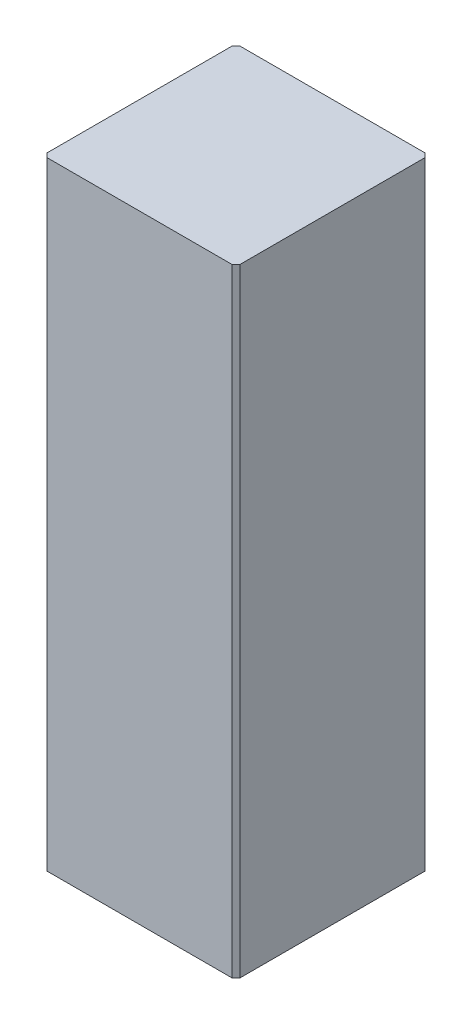
ISO-10303-21;
HEADER;
FILE_DESCRIPTION(('STEP AP214'),'2;1');
FILE_NAME('part.step','',(''),(''),'','','');
FILE_SCHEMA(('AUTOMOTIVE_DESIGN { 1 0 10303 214 1 1 1 1 }'));
ENDSEC;
DATA;
#1=APPLICATION_CONTEXT('core data for automotive mechanical design processes');
#2=APPLICATION_PROTOCOL_DEFINITION('international standard','automotive_design',2000,#1);
#3=PRODUCT_CONTEXT('',#1,'mechanical');
#4=PRODUCT('Part','Part','',(#3));
#5=PRODUCT_RELATED_PRODUCT_CATEGORY('part','',(#4));
#6=PRODUCT_DEFINITION_FORMATION('','',#4);
#7=PRODUCT_DEFINITION_CONTEXT('part definition',#1,'design');
#8=PRODUCT_DEFINITION('design','',#6,#7);
#9=PRODUCT_DEFINITION_SHAPE('','',#8);
#10=(LENGTH_UNIT() NAMED_UNIT(*) SI_UNIT(.MILLI.,.METRE.));
#11=(NAMED_UNIT(*) PLANE_ANGLE_UNIT() SI_UNIT($,.RADIAN.));
#12=(NAMED_UNIT(*) SI_UNIT($,.STERADIAN.) SOLID_ANGLE_UNIT());
#13=UNCERTAINTY_MEASURE_WITH_UNIT(LENGTH_MEASURE(1.E-05),#10,'distance_accuracy_value','');
#14=(GEOMETRIC_REPRESENTATION_CONTEXT(3) GLOBAL_UNCERTAINTY_ASSIGNED_CONTEXT((#13)) GLOBAL_UNIT_ASSIGNED_CONTEXT((#10,
#11,#12)) REPRESENTATION_CONTEXT('',''));
#15=CARTESIAN_POINT('',(0.,0.,0.));
#16=DIRECTION('',(0.,0.,1.));
#17=DIRECTION('',(1.,0.,0.));
#18=AXIS2_PLACEMENT_3D('',#15,#16,#17);
#19=CARTESIAN_POINT('',(0.,20.32,0.));
#20=DIRECTION('',(1.,0.,0.));
#21=DIRECTION('',(0.,0.,-1.));
#22=AXIS2_PLACEMENT_3D('',#19,#20,#21);
#23=PLANE('',#22);
#24=DIRECTION('',(0.,0.,1.));
#25=VECTOR('',#24,1.);
#26=CARTESIAN_POINT('',(0.,20.32,0.));
#27=LINE('',#26,#25);
#28=CARTESIAN_POINT('',(0.,20.32,-6.223));
#29=VERTEX_POINT('',#28);
#30=CARTESIAN_POINT('',(0.,20.32,-0.126999999999999));
#31=VERTEX_POINT('',#30);
#32=EDGE_CURVE('E124',#29,#31,#27,.T.);
#33=ORIENTED_EDGE('',*,*,#32,.F.);
#34=DIRECTION('',(0.,-1.,0.));
#35=VECTOR('',#34,1.);
#36=CARTESIAN_POINT('',(0.,20.32,-6.223));
#37=LINE('',#36,#35);
#38=CARTESIAN_POINT('',(0.,0.,-6.223));
#39=VERTEX_POINT('',#38);
#40=EDGE_CURVE('E109',#29,#39,#37,.T.);
#41=ORIENTED_EDGE('',*,*,#40,.T.);
#42=DIRECTION('',(0.,0.,1.));
#43=VECTOR('',#42,1.);
#44=CARTESIAN_POINT('',(0.,0.,0.));
#45=LINE('',#44,#43);
#46=CARTESIAN_POINT('',(0.,0.,-0.126999999999999));
#47=VERTEX_POINT('',#46);
#48=EDGE_CURVE('E121',#39,#47,#45,.T.);
#49=ORIENTED_EDGE('',*,*,#48,.T.);
#50=DIRECTION('',(0.,1.,0.));
#51=VECTOR('',#50,1.);
#52=CARTESIAN_POINT('',(0.,20.32,-0.126999999999999));
#53=LINE('',#52,#51);
#54=EDGE_CURVE('E126',#47,#31,#53,.T.);
#55=ORIENTED_EDGE('',*,*,#54,.T.);
#56=EDGE_LOOP('',(#33,#41,#49,#55));
#57=FACE_BOUND('',#56,.T.);
#58=ADVANCED_FACE('F37',(#57),#23,.F.);
#59=CARTESIAN_POINT('',(0.,20.32,0.));
#60=DIRECTION('',(0.,0.,-1.));
#61=DIRECTION('',(-1.,0.,0.));
#62=AXIS2_PLACEMENT_3D('',#59,#60,#61);
#63=PLANE('',#62);
#64=DIRECTION('',(1.,0.,0.));
#65=VECTOR('',#64,1.);
#66=CARTESIAN_POINT('',(0.,20.32,0.));
#67=LINE('',#66,#65);
#68=CARTESIAN_POINT('',(0.126999999999995,20.32,0.));
#69=VERTEX_POINT('',#68);
#70=CARTESIAN_POINT('',(6.223,20.32,0.));
#71=VERTEX_POINT('',#70);
#72=EDGE_CURVE('E164',#69,#71,#67,.T.);
#73=ORIENTED_EDGE('',*,*,#72,.F.);
#74=DIRECTION('',(0.,-1.,0.));
#75=VECTOR('',#74,1.);
#76=CARTESIAN_POINT('',(0.126999999999995,20.32,0.));
#77=LINE('',#76,#75);
#78=CARTESIAN_POINT('',(0.126999999999995,0.,0.));
#79=VERTEX_POINT('',#78);
#80=EDGE_CURVE('E11',#69,#79,#77,.T.);
#81=ORIENTED_EDGE('',*,*,#80,.T.);
#82=DIRECTION('',(1.,0.,0.));
#83=VECTOR('',#82,1.);
#84=CARTESIAN_POINT('',(0.,0.,0.));
#85=LINE('',#84,#83);
#86=CARTESIAN_POINT('',(6.223,0.,0.));
#87=VERTEX_POINT('',#86);
#88=EDGE_CURVE('E131',#79,#87,#85,.T.);
#89=ORIENTED_EDGE('',*,*,#88,.T.);
#90=DIRECTION('',(0.,1.,0.));
#91=VECTOR('',#90,1.);
#92=CARTESIAN_POINT('',(6.223,20.32,0.));
#93=LINE('',#92,#91);
#94=EDGE_CURVE('E46',#87,#71,#93,.T.);
#95=ORIENTED_EDGE('',*,*,#94,.T.);
#96=EDGE_LOOP('',(#73,#81,#89,#95));
#97=FACE_BOUND('',#96,.T.);
#98=ADVANCED_FACE('F163',(#97),#63,.F.);
#99=CARTESIAN_POINT('',(6.35,20.32,0.));
#100=DIRECTION('',(-1.,0.,0.));
#101=DIRECTION('',(0.,0.,1.));
#102=AXIS2_PLACEMENT_3D('',#99,#100,#101);
#103=PLANE('',#102);
#104=DIRECTION('',(0.,0.,-1.));
#105=VECTOR('',#104,1.);
#106=CARTESIAN_POINT('',(6.35,0.,0.));
#107=LINE('',#106,#105);
#108=CARTESIAN_POINT('',(6.35,0.,-0.126999999999995));
#109=VERTEX_POINT('',#108);
#110=CARTESIAN_POINT('',(6.35,0.,-6.223));
#111=VERTEX_POINT('',#110);
#112=EDGE_CURVE('E134',#109,#111,#107,.T.);
#113=ORIENTED_EDGE('',*,*,#112,.T.);
#114=DIRECTION('',(0.,1.,0.));
#115=VECTOR('',#114,1.);
#116=CARTESIAN_POINT('',(6.35,20.32,-6.223));
#117=LINE('',#116,#115);
#118=CARTESIAN_POINT('',(6.35,20.32,-6.223));
#119=VERTEX_POINT('',#118);
#120=EDGE_CURVE('E53',#111,#119,#117,.T.);
#121=ORIENTED_EDGE('',*,*,#120,.T.);
#122=DIRECTION('',(0.,0.,-1.));
#123=VECTOR('',#122,1.);
#124=CARTESIAN_POINT('',(6.35,20.32,0.));
#125=LINE('',#124,#123);
#126=CARTESIAN_POINT('',(6.35,20.32,-0.126999999999995));
#127=VERTEX_POINT('',#126);
#128=EDGE_CURVE('E170',#127,#119,#125,.T.);
#129=ORIENTED_EDGE('',*,*,#128,.F.);
#130=DIRECTION('',(0.,-1.,0.));
#131=VECTOR('',#130,1.);
#132=CARTESIAN_POINT('',(6.35,20.32,-0.126999999999995));
#133=LINE('',#132,#131);
#134=EDGE_CURVE('E157',#127,#109,#133,.T.);
#135=ORIENTED_EDGE('',*,*,#134,.T.);
#136=EDGE_LOOP('',(#113,#121,#129,#135));
#137=FACE_BOUND('',#136,.T.);
#138=ADVANCED_FACE('F174',(#137),#103,.F.);
#139=CARTESIAN_POINT('',(0.,20.32,-6.35));
#140=DIRECTION('',(0.,0.,1.));
#141=DIRECTION('',(1.,0.,0.));
#142=AXIS2_PLACEMENT_3D('',#139,#140,#141);
#143=PLANE('',#142);
#144=DIRECTION('',(-1.,0.,0.));
#145=VECTOR('',#144,1.);
#146=CARTESIAN_POINT('',(0.,0.,-6.35));
#147=LINE('',#146,#145);
#148=CARTESIAN_POINT('',(6.223,0.,-6.35));
#149=VERTEX_POINT('',#148);
#150=CARTESIAN_POINT('',(0.126999999999999,0.,-6.35));
#151=VERTEX_POINT('',#150);
#152=EDGE_CURVE('E141',#149,#151,#147,.T.);
#153=ORIENTED_EDGE('',*,*,#152,.T.);
#154=DIRECTION('',(0.,1.,0.));
#155=VECTOR('',#154,1.);
#156=CARTESIAN_POINT('',(0.126999999999999,20.32,-6.35));
#157=LINE('',#156,#155);
#158=CARTESIAN_POINT('',(0.126999999999999,20.32,-6.35));
#159=VERTEX_POINT('',#158);
#160=EDGE_CURVE('E110',#151,#159,#157,.T.);
#161=ORIENTED_EDGE('',*,*,#160,.T.);
#162=DIRECTION('',(-1.,0.,0.));
#163=VECTOR('',#162,1.);
#164=CARTESIAN_POINT('',(0.,20.32,-6.35));
#165=LINE('',#164,#163);
#166=CARTESIAN_POINT('',(6.223,20.32,-6.35));
#167=VERTEX_POINT('',#166);
#168=EDGE_CURVE('E137',#167,#159,#165,.T.);
#169=ORIENTED_EDGE('',*,*,#168,.F.);
#170=DIRECTION('',(0.,-1.,0.));
#171=VECTOR('',#170,1.);
#172=CARTESIAN_POINT('',(6.223,20.32,-6.35));
#173=LINE('',#172,#171);
#174=EDGE_CURVE('E115',#167,#149,#173,.T.);
#175=ORIENTED_EDGE('',*,*,#174,.T.);
#176=EDGE_LOOP('',(#153,#161,#169,#175));
#177=FACE_BOUND('',#176,.T.);
#178=ADVANCED_FACE('F181',(#177),#143,.F.);
#179=CARTESIAN_POINT('',(0.,20.32,0.));
#180=DIRECTION('',(0.,-1.,0.));
#181=DIRECTION('',(0.,0.,-1.));
#182=AXIS2_PLACEMENT_3D('',#179,#180,#181);
#183=PLANE('',#182);
#184=ORIENTED_EDGE('',*,*,#168,.T.);
#185=DIRECTION('',(0.707106781186557,0.,-0.707106781186538));
#186=VECTOR('',#185,1.);
#187=CARTESIAN_POINT('',(0.,20.32,-6.223));
#188=LINE('',#187,#186);
#189=EDGE_CURVE('E155',#159,#29,#188,.F.);
#190=ORIENTED_EDGE('',*,*,#189,.T.);
#191=ORIENTED_EDGE('',*,*,#32,.T.);
#192=DIRECTION('',(-0.707106781186538,0.,-0.707106781186557));
#193=VECTOR('',#192,1.);
#194=CARTESIAN_POINT('',(0.126999999999995,20.32,0.));
#195=LINE('',#194,#193);
#196=EDGE_CURVE('E151',#31,#69,#195,.F.);
#197=ORIENTED_EDGE('',*,*,#196,.T.);
#198=ORIENTED_EDGE('',*,*,#72,.T.);
#199=DIRECTION('',(-0.707106781186557,0.,0.707106781186538));
#200=VECTOR('',#199,1.);
#201=CARTESIAN_POINT('',(6.35,20.32,-0.126999999999995));
#202=LINE('',#201,#200);
#203=EDGE_CURVE('E60',#71,#127,#202,.F.);
#204=ORIENTED_EDGE('',*,*,#203,.T.);
#205=ORIENTED_EDGE('',*,*,#128,.T.);
#206=DIRECTION('',(0.707106781186548,0.,0.707106781186548));
#207=VECTOR('',#206,1.);
#208=CARTESIAN_POINT('',(6.223,20.32,-6.35));
#209=LINE('',#208,#207);
#210=EDGE_CURVE('E153',#119,#167,#209,.F.);
#211=ORIENTED_EDGE('',*,*,#210,.T.);
#212=EDGE_LOOP('',(#184,#190,#191,#197,#198,#204,#205,#211));
#213=FACE_BOUND('',#212,.T.);
#214=ADVANCED_FACE('F168',(#213),#183,.F.);
#215=CARTESIAN_POINT('',(0.,0.,0.));
#216=DIRECTION('',(0.,-1.,0.));
#217=DIRECTION('',(0.,0.,-1.));
#218=AXIS2_PLACEMENT_3D('',#215,#216,#217);
#219=PLANE('',#218);
#220=ORIENTED_EDGE('',*,*,#48,.F.);
#221=DIRECTION('',(-0.707106781186557,0.,0.707106781186538));
#222=VECTOR('',#221,1.);
#223=CARTESIAN_POINT('',(-3.1115,0.,-3.11150000000009));
#224=LINE('',#223,#222);
#225=EDGE_CURVE('E105',#39,#151,#224,.F.);
#226=ORIENTED_EDGE('',*,*,#225,.T.);
#227=ORIENTED_EDGE('',*,*,#152,.F.);
#228=DIRECTION('',(-0.707106781186548,0.,-0.707106781186548));
#229=VECTOR('',#228,1.);
#230=CARTESIAN_POINT('',(6.2865,0.,-6.2865));
#231=LINE('',#230,#229);
#232=EDGE_CURVE('E116',#149,#111,#231,.F.);
#233=ORIENTED_EDGE('',*,*,#232,.T.);
#234=ORIENTED_EDGE('',*,*,#112,.F.);
#235=DIRECTION('',(0.707106781186557,0.,-0.707106781186538));
#236=VECTOR('',#235,1.);
#237=CARTESIAN_POINT('',(3.11149999999992,0.,3.1115));
#238=LINE('',#237,#236);
#239=EDGE_CURVE('E125',#109,#87,#238,.F.);
#240=ORIENTED_EDGE('',*,*,#239,.T.);
#241=ORIENTED_EDGE('',*,*,#88,.F.);
#242=DIRECTION('',(0.707106781186538,0.,0.707106781186557));
#243=VECTOR('',#242,1.);
#244=CARTESIAN_POINT('',(0.0634999999999993,0.,-0.0634999999999976));
#245=LINE('',#244,#243);
#246=EDGE_CURVE('E130',#79,#47,#245,.F.);
#247=ORIENTED_EDGE('',*,*,#246,.T.);
#248=EDGE_LOOP('',(#220,#226,#227,#233,#234,#240,#241,#247));
#249=FACE_BOUND('',#248,.T.);
#250=ADVANCED_FACE('F128',(#249),#219,.T.);
#251=CARTESIAN_POINT('',(0.,20.32,-6.223));
#252=DIRECTION('',(0.707106781186538,0.,0.707106781186557));
#253=DIRECTION('',(0.,-1.,0.));
#254=AXIS2_PLACEMENT_3D('',#251,#252,#253);
#255=PLANE('',#254);
#256=ORIENTED_EDGE('',*,*,#189,.F.);
#257=ORIENTED_EDGE('',*,*,#160,.F.);
#258=ORIENTED_EDGE('',*,*,#225,.F.);
#259=ORIENTED_EDGE('',*,*,#40,.F.);
#260=EDGE_LOOP('',(#256,#257,#258,#259));
#261=FACE_BOUND('',#260,.T.);
#262=ADVANCED_FACE('F108',(#261),#255,.F.);
#263=CARTESIAN_POINT('',(6.223,20.32,-6.35));
#264=DIRECTION('',(-0.707106781186547,0.,0.707106781186547));
#265=DIRECTION('',(0.,-1.,0.));
#266=AXIS2_PLACEMENT_3D('',#263,#264,#265);
#267=PLANE('',#266);
#268=ORIENTED_EDGE('',*,*,#210,.F.);
#269=ORIENTED_EDGE('',*,*,#120,.F.);
#270=ORIENTED_EDGE('',*,*,#232,.F.);
#271=ORIENTED_EDGE('',*,*,#174,.F.);
#272=EDGE_LOOP('',(#268,#269,#270,#271));
#273=FACE_BOUND('',#272,.T.);
#274=ADVANCED_FACE('F178',(#273),#267,.F.);
#275=CARTESIAN_POINT('',(0.126999999999995,20.32,0.));
#276=DIRECTION('',(0.707106781186557,0.,-0.707106781186538));
#277=DIRECTION('',(0.,-1.,0.));
#278=AXIS2_PLACEMENT_3D('',#275,#276,#277);
#279=PLANE('',#278);
#280=ORIENTED_EDGE('',*,*,#196,.F.);
#281=ORIENTED_EDGE('',*,*,#54,.F.);
#282=ORIENTED_EDGE('',*,*,#246,.F.);
#283=ORIENTED_EDGE('',*,*,#80,.F.);
#284=EDGE_LOOP('',(#280,#281,#282,#283));
#285=FACE_BOUND('',#284,.T.);
#286=ADVANCED_FACE('F184',(#285),#279,.F.);
#287=CARTESIAN_POINT('',(6.35,20.32,-0.126999999999995));
#288=DIRECTION('',(-0.707106781186538,0.,-0.707106781186557));
#289=DIRECTION('',(0.,-1.,0.));
#290=AXIS2_PLACEMENT_3D('',#287,#288,#289);
#291=PLANE('',#290);
#292=ORIENTED_EDGE('',*,*,#203,.F.);
#293=ORIENTED_EDGE('',*,*,#94,.F.);
#294=ORIENTED_EDGE('',*,*,#239,.F.);
#295=ORIENTED_EDGE('',*,*,#134,.F.);
#296=EDGE_LOOP('',(#292,#293,#294,#295));
#297=FACE_BOUND('',#296,.T.);
#298=ADVANCED_FACE('F40',(#297),#291,.F.);
#299=CLOSED_SHELL('',(#58,#98,#138,#178,#214,#250,#262,#274,#286,#298));
#300=MANIFOLD_SOLID_BREP('B2',#299);
#301=ADVANCED_BREP_SHAPE_REPRESENTATION('',(#18,#300),#14);
#302=SHAPE_DEFINITION_REPRESENTATION(#9,#301);
ENDSEC;
END-ISO-10303-21;
